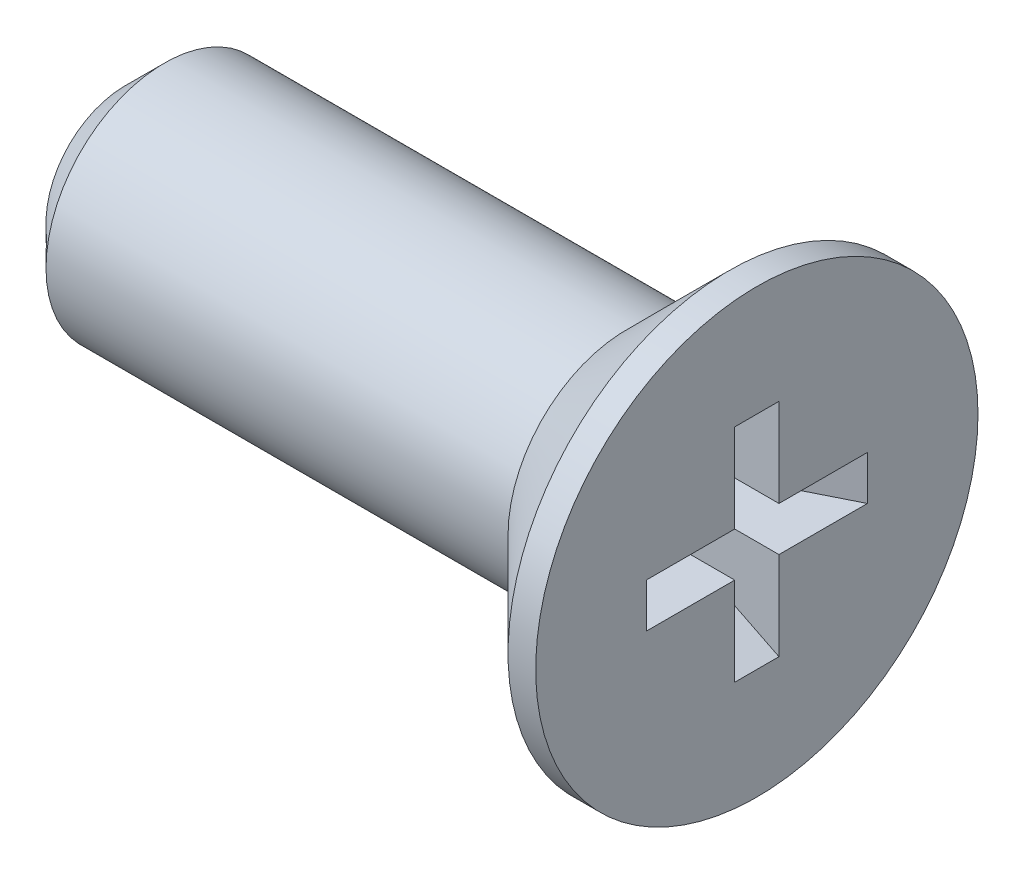
ISO-10303-21;
HEADER;
FILE_DESCRIPTION(('STEP AP214'),'2;1');
FILE_NAME('part.step','',(''),(''),'','','');
FILE_SCHEMA(('AUTOMOTIVE_DESIGN { 1 0 10303 214 1 1 1 1 }'));
ENDSEC;
DATA;
#1=APPLICATION_CONTEXT('core data for automotive mechanical design processes');
#2=APPLICATION_PROTOCOL_DEFINITION('international standard','automotive_design',2000,#1);
#3=PRODUCT_CONTEXT('',#1,'mechanical');
#4=PRODUCT('Part','Part','',(#3));
#5=PRODUCT_RELATED_PRODUCT_CATEGORY('part','',(#4));
#6=PRODUCT_DEFINITION_FORMATION('','',#4);
#7=PRODUCT_DEFINITION_CONTEXT('part definition',#1,'design');
#8=PRODUCT_DEFINITION('design','',#6,#7);
#9=PRODUCT_DEFINITION_SHAPE('','',#8);
#10=(LENGTH_UNIT() NAMED_UNIT(*) SI_UNIT(.MILLI.,.METRE.));
#11=(NAMED_UNIT(*) PLANE_ANGLE_UNIT() SI_UNIT($,.RADIAN.));
#12=(NAMED_UNIT(*) SI_UNIT($,.STERADIAN.) SOLID_ANGLE_UNIT());
#13=UNCERTAINTY_MEASURE_WITH_UNIT(LENGTH_MEASURE(1.E-05),#10,'distance_accuracy_value','');
#14=(GEOMETRIC_REPRESENTATION_CONTEXT(3) GLOBAL_UNCERTAINTY_ASSIGNED_CONTEXT((#13)) GLOBAL_UNIT_ASSIGNED_CONTEXT((#10,
#11,#12)) REPRESENTATION_CONTEXT('',''));
#15=CARTESIAN_POINT('',(0.,0.,0.));
#16=DIRECTION('',(0.,0.,1.));
#17=DIRECTION('',(1.,0.,0.));
#18=AXIS2_PLACEMENT_3D('',#15,#16,#17);
#19=CARTESIAN_POINT('',(0.,0.,-0.28));
#20=DIRECTION('',(0.,0.,-1.));
#21=DIRECTION('',(-1.,0.,0.));
#22=AXIS2_PLACEMENT_3D('',#19,#20,#21);
#23=PLANE('',#22);
#24=DIRECTION('',(1.,0.,0.));
#25=VECTOR('',#24,1.);
#26=CARTESIAN_POINT('',(0.,-0.279999999999999,-0.28));
#27=LINE('',#26,#25);
#28=CARTESIAN_POINT('',(-1.69786374827842,-0.28,-0.28));
#29=VERTEX_POINT('',#28);
#30=CARTESIAN_POINT('',(0.,-0.279999999999999,-0.28));
#31=VERTEX_POINT('',#30);
#32=EDGE_CURVE('E178',#29,#31,#27,.T.);
#33=ORIENTED_EDGE('',*,*,#32,.F.);
#34=DIRECTION('',(0.469471562785891,-0.882947592858927,0.));
#35=VECTOR('',#34,1.);
#36=CARTESIAN_POINT('',(-1.69786374827842,-0.28,-0.28));
#37=LINE('',#36,#35);
#38=CARTESIAN_POINT('',(-1.5,-0.65212758791985,-0.28));
#39=VERTEX_POINT('',#38);
#40=EDGE_CURVE('E185',#29,#39,#37,.T.);
#41=ORIENTED_EDGE('',*,*,#40,.T.);
#42=DIRECTION('',(0.894934361602024,-0.44619781310981,0.));
#43=VECTOR('',#42,1.);
#44=CARTESIAN_POINT('',(-1.5,-0.65212758791985,-0.28));
#45=LINE('',#44,#43);
#46=CARTESIAN_POINT('',(0.,-1.4,-0.28));
#47=VERTEX_POINT('',#46);
#48=EDGE_CURVE('E188',#39,#47,#45,.T.);
#49=ORIENTED_EDGE('',*,*,#48,.T.);
#50=DIRECTION('',(0.,1.,0.));
#51=VECTOR('',#50,1.);
#52=CARTESIAN_POINT('',(0.,1.4,-0.28));
#53=LINE('',#52,#51);
#54=EDGE_CURVE('E193',#47,#31,#53,.T.);
#55=ORIENTED_EDGE('',*,*,#54,.T.);
#56=EDGE_LOOP('',(#33,#41,#49,#55));
#57=FACE_BOUND('',#56,.T.);
#58=ADVANCED_FACE('F39',(#57),#23,.F.);
#59=CARTESIAN_POINT('',(0.,0.,0.28));
#60=DIRECTION('',(0.,0.,-1.));
#61=DIRECTION('',(-1.,0.,0.));
#62=AXIS2_PLACEMENT_3D('',#59,#60,#61);
#63=PLANE('',#62);
#64=DIRECTION('',(0.469471562785891,-0.882947592858927,0.));
#65=VECTOR('',#64,1.);
#66=CARTESIAN_POINT('',(-1.69786374827842,-0.28,0.28));
#67=LINE('',#66,#65);
#68=CARTESIAN_POINT('',(-1.69786374827842,-0.280000000000001,0.279999999999999));
#69=VERTEX_POINT('',#68);
#70=CARTESIAN_POINT('',(-1.5,-0.65212758791985,0.28));
#71=VERTEX_POINT('',#70);
#72=EDGE_CURVE('E184',#69,#71,#67,.T.);
#73=ORIENTED_EDGE('',*,*,#72,.F.);
#74=DIRECTION('',(1.,0.,0.));
#75=VECTOR('',#74,1.);
#76=CARTESIAN_POINT('',(0.,-0.280000000000001,0.28));
#77=LINE('',#76,#75);
#78=CARTESIAN_POINT('',(0.,-0.280000000000001,0.28));
#79=VERTEX_POINT('',#78);
#80=EDGE_CURVE('E47',#69,#79,#77,.T.);
#81=ORIENTED_EDGE('',*,*,#80,.T.);
#82=DIRECTION('',(0.,1.,0.));
#83=VECTOR('',#82,1.);
#84=CARTESIAN_POINT('',(0.,1.4,0.28));
#85=LINE('',#84,#83);
#86=CARTESIAN_POINT('',(0.,-1.4,0.28));
#87=VERTEX_POINT('',#86);
#88=EDGE_CURVE('E210',#87,#79,#85,.T.);
#89=ORIENTED_EDGE('',*,*,#88,.F.);
#90=DIRECTION('',(0.894934361602024,-0.44619781310981,0.));
#91=VECTOR('',#90,1.);
#92=CARTESIAN_POINT('',(-1.5,-0.65212758791985,0.28));
#93=LINE('',#92,#91);
#94=EDGE_CURVE('E207',#71,#87,#93,.T.);
#95=ORIENTED_EDGE('',*,*,#94,.F.);
#96=EDGE_LOOP('',(#73,#81,#89,#95));
#97=FACE_BOUND('',#96,.T.);
#98=ADVANCED_FACE('F257',(#97),#63,.T.);
#99=CARTESIAN_POINT('',(-8.,0.,0.));
#100=DIRECTION('',(1.,0.,0.));
#101=DIRECTION('',(0.,0.,-1.));
#102=AXIS2_PLACEMENT_3D('',#99,#100,#101);
#103=CYLINDRICAL_SURFACE('',#102,1.5);
#104=CARTESIAN_POINT('',(-1.65,0.,0.));
#105=DIRECTION('',(-1.,0.,0.));
#106=DIRECTION('',(0.,0.,1.));
#107=AXIS2_PLACEMENT_3D('',#104,#105,#106);
#108=CIRCLE('',#107,1.5);
#109=CARTESIAN_POINT('',(-1.65,0.,1.5));
#110=VERTEX_POINT('',#109);
#111=EDGE_CURVE('E252',#110,#110,#108,.F.);
#112=ORIENTED_EDGE('',*,*,#111,.F.);
#113=EDGE_LOOP('',(#112));
#114=FACE_BOUND('',#113,.T.);
#115=CARTESIAN_POINT('',(-7.5,0.,0.));
#116=DIRECTION('',(1.,0.,0.));
#117=DIRECTION('',(0.,0.,-1.));
#118=AXIS2_PLACEMENT_3D('',#115,#116,#117);
#119=CIRCLE('',#118,1.5);
#120=CARTESIAN_POINT('',(-7.5,0.,-1.5));
#121=VERTEX_POINT('',#120);
#122=EDGE_CURVE('E244',#121,#121,#119,.T.);
#123=ORIENTED_EDGE('',*,*,#122,.T.);
#124=EDGE_LOOP('',(#123));
#125=FACE_BOUND('',#124,.T.);
#126=ADVANCED_FACE('F308',(#114,#125),#103,.T.);
#127=CARTESIAN_POINT('',(-8.,0.,0.));
#128=DIRECTION('',(1.,0.,0.));
#129=DIRECTION('',(0.,0.,-1.));
#130=AXIS2_PLACEMENT_3D('',#127,#128,#129);
#131=PLANE('',#130);
#132=CARTESIAN_POINT('',(-8.,0.,0.));
#133=DIRECTION('',(1.,0.,0.));
#134=DIRECTION('',(0.,0.,-1.));
#135=AXIS2_PLACEMENT_3D('',#132,#133,#134);
#136=CIRCLE('',#135,0.999999999999998);
#137=CARTESIAN_POINT('',(-8.,0.,-0.999999999999998));
#138=VERTEX_POINT('',#137);
#139=EDGE_CURVE('E248',#138,#138,#136,.F.);
#140=ORIENTED_EDGE('',*,*,#139,.T.);
#141=EDGE_LOOP('',(#140));
#142=FACE_BOUND('',#141,.T.);
#143=ADVANCED_FACE('F330',(#142),#131,.F.);
#144=CARTESIAN_POINT('',(-7.5,0.,0.));
#145=DIRECTION('',(1.,0.,0.));
#146=DIRECTION('',(0.,0.,-1.));
#147=AXIS2_PLACEMENT_3D('',#144,#145,#146);
#148=CONICAL_SURFACE('',#147,1.5,0.78539816339745);
#149=ORIENTED_EDGE('',*,*,#139,.F.);
#150=EDGE_LOOP('',(#149));
#151=FACE_BOUND('',#150,.T.);
#152=ORIENTED_EDGE('',*,*,#122,.F.);
#153=EDGE_LOOP('',(#152));
#154=FACE_BOUND('',#153,.T.);
#155=ADVANCED_FACE('F41',(#151,#154),#148,.T.);
#156=CARTESIAN_POINT('',(0.,0.,0.));
#157=DIRECTION('',(1.,0.,0.));
#158=DIRECTION('',(0.,0.,-1.));
#159=AXIS2_PLACEMENT_3D('',#156,#157,#158);
#160=CYLINDRICAL_SURFACE('',#159,2.8);
#161=CARTESIAN_POINT('',(-0.350000000000004,0.,0.));
#162=DIRECTION('',(1.,0.,0.));
#163=DIRECTION('',(0.,0.,-1.));
#164=AXIS2_PLACEMENT_3D('',#161,#162,#163);
#165=CIRCLE('',#164,2.8);
#166=CARTESIAN_POINT('',(-0.350000000000004,0.,-2.8));
#167=VERTEX_POINT('',#166);
#168=EDGE_CURVE('E224',#167,#167,#165,.T.);
#169=ORIENTED_EDGE('',*,*,#168,.T.);
#170=EDGE_LOOP('',(#169));
#171=FACE_BOUND('',#170,.T.);
#172=CARTESIAN_POINT('',(0.,0.,0.));
#173=DIRECTION('',(1.,0.,0.));
#174=DIRECTION('',(0.,0.,-1.));
#175=AXIS2_PLACEMENT_3D('',#172,#173,#174);
#176=CIRCLE('',#175,2.8);
#177=CARTESIAN_POINT('',(0.,0.,-2.8));
#178=VERTEX_POINT('',#177);
#179=EDGE_CURVE('E240',#178,#178,#176,.T.);
#180=ORIENTED_EDGE('',*,*,#179,.F.);
#181=EDGE_LOOP('',(#180));
#182=FACE_BOUND('',#181,.T.);
#183=ADVANCED_FACE('F325',(#171,#182),#160,.T.);
#184=CARTESIAN_POINT('',(-0.350000000000004,0.,0.));
#185=DIRECTION('',(1.,0.,0.));
#186=DIRECTION('',(0.,0.,-1.));
#187=AXIS2_PLACEMENT_3D('',#184,#185,#186);
#188=CONICAL_SURFACE('',#187,2.8,0.78539816339745);
#189=ORIENTED_EDGE('',*,*,#111,.T.);
#190=EDGE_LOOP('',(#189));
#191=FACE_BOUND('',#190,.T.);
#192=ORIENTED_EDGE('',*,*,#168,.F.);
#193=EDGE_LOOP('',(#192));
#194=FACE_BOUND('',#193,.T.);
#195=ADVANCED_FACE('F322',(#191,#194),#188,.T.);
#196=CARTESIAN_POINT('',(0.,0.,0.));
#197=DIRECTION('',(1.,0.,0.));
#198=DIRECTION('',(0.,0.,-1.));
#199=AXIS2_PLACEMENT_3D('',#196,#197,#198);
#200=PLANE('',#199);
#201=DIRECTION('',(0.,0.,1.));
#202=VECTOR('',#201,1.);
#203=CARTESIAN_POINT('',(0.,0.279999999999995,1.4));
#204=LINE('',#203,#202);
#205=CARTESIAN_POINT('',(0.,0.280000000000005,-1.4));
#206=VERTEX_POINT('',#205);
#207=CARTESIAN_POINT('',(0.,0.280000000000001,-0.28));
#208=VERTEX_POINT('',#207);
#209=EDGE_CURVE('E161',#206,#208,#204,.T.);
#210=ORIENTED_EDGE('',*,*,#209,.F.);
#211=DIRECTION('',(0.,-1.,0.));
#212=VECTOR('',#211,1.);
#213=CARTESIAN_POINT('',(0.,0.280000000000005,-1.4));
#214=LINE('',#213,#212);
#215=CARTESIAN_POINT('',(0.,-0.279999999999995,-1.4));
#216=VERTEX_POINT('',#215);
#217=EDGE_CURVE('E141',#206,#216,#214,.T.);
#218=ORIENTED_EDGE('',*,*,#217,.T.);
#219=DIRECTION('',(0.,0.,1.));
#220=VECTOR('',#219,1.);
#221=CARTESIAN_POINT('',(0.,-0.280000000000005,1.4));
#222=LINE('',#221,#220);
#223=EDGE_CURVE('E171',#216,#31,#222,.T.);
#224=ORIENTED_EDGE('',*,*,#223,.T.);
#225=ORIENTED_EDGE('',*,*,#54,.F.);
#226=DIRECTION('',(0.,0.,1.));
#227=VECTOR('',#226,1.);
#228=CARTESIAN_POINT('',(0.,-1.4,-0.28));
#229=LINE('',#228,#227);
#230=EDGE_CURVE('E233',#47,#87,#229,.T.);
#231=ORIENTED_EDGE('',*,*,#230,.T.);
#232=ORIENTED_EDGE('',*,*,#88,.T.);
#233=CARTESIAN_POINT('',(0.,-0.280000000000005,1.4));
#234=VERTEX_POINT('',#233);
#235=EDGE_CURVE('E54',#79,#234,#222,.T.);
#236=ORIENTED_EDGE('',*,*,#235,.T.);
#237=DIRECTION('',(0.,-1.,0.));
#238=VECTOR('',#237,1.);
#239=CARTESIAN_POINT('',(0.,0.279999999999995,1.4));
#240=LINE('',#239,#238);
#241=CARTESIAN_POINT('',(0.,0.279999999999995,1.4));
#242=VERTEX_POINT('',#241);
#243=EDGE_CURVE('E179',#242,#234,#240,.T.);
#244=ORIENTED_EDGE('',*,*,#243,.F.);
#245=CARTESIAN_POINT('',(0.,0.279999999999999,0.28));
#246=VERTEX_POINT('',#245);
#247=EDGE_CURVE('E150',#246,#242,#204,.T.);
#248=ORIENTED_EDGE('',*,*,#247,.F.);
#249=CARTESIAN_POINT('',(0.,1.4,0.28));
#250=VERTEX_POINT('',#249);
#251=EDGE_CURVE('E62',#246,#250,#85,.T.);
#252=ORIENTED_EDGE('',*,*,#251,.T.);
#253=DIRECTION('',(0.,0.,1.));
#254=VECTOR('',#253,1.);
#255=CARTESIAN_POINT('',(0.,1.4,-0.28));
#256=LINE('',#255,#254);
#257=CARTESIAN_POINT('',(0.,1.4,-0.28));
#258=VERTEX_POINT('',#257);
#259=EDGE_CURVE('E230',#258,#250,#256,.T.);
#260=ORIENTED_EDGE('',*,*,#259,.F.);
#261=EDGE_CURVE('E192',#208,#258,#53,.T.);
#262=ORIENTED_EDGE('',*,*,#261,.F.);
#263=EDGE_LOOP('',(#210,#218,#224,#225,#231,#232,#236,#244,#248,#252,#260,#262));
#264=FACE_BOUND('',#263,.T.);
#265=ORIENTED_EDGE('',*,*,#179,.T.);
#266=EDGE_LOOP('',(#265));
#267=FACE_BOUND('',#266,.T.);
#268=ADVANCED_FACE('F260',(#264,#267),#200,.T.);
#269=CARTESIAN_POINT('',(-1.69786374827842,-0.28,-0.28));
#270=DIRECTION('',(-0.882947592858927,-0.469471562785891,0.));
#271=DIRECTION('',(0.469471562785891,-0.882947592858927,0.));
#272=AXIS2_PLACEMENT_3D('',#269,#270,#271);
#273=PLANE('',#272);
#274=ORIENTED_EDGE('',*,*,#72,.T.);
#275=DIRECTION('',(0.,0.,1.));
#276=VECTOR('',#275,1.);
#277=CARTESIAN_POINT('',(-1.5,-0.65212758791985,-0.28));
#278=LINE('',#277,#276);
#279=EDGE_CURVE('E204',#39,#71,#278,.T.);
#280=ORIENTED_EDGE('',*,*,#279,.F.);
#281=ORIENTED_EDGE('',*,*,#40,.F.);
#282=DIRECTION('',(0.,0.,1.));
#283=VECTOR('',#282,1.);
#284=CARTESIAN_POINT('',(-1.69786374827842,-0.28,-0.28));
#285=LINE('',#284,#283);
#286=EDGE_CURVE('E221',#29,#69,#285,.T.);
#287=ORIENTED_EDGE('',*,*,#286,.T.);
#288=EDGE_LOOP('',(#274,#280,#281,#287));
#289=FACE_BOUND('',#288,.T.);
#290=ADVANCED_FACE('F272',(#289),#273,.F.);
#291=CARTESIAN_POINT('',(-1.69786374827842,-0.28,-0.28));
#292=DIRECTION('',(-1.,0.,0.));
#293=DIRECTION('',(0.,0.,1.));
#294=AXIS2_PLACEMENT_3D('',#291,#292,#293);
#295=PLANE('',#294);
#296=DIRECTION('',(0.,-1.,0.));
#297=VECTOR('',#296,1.);
#298=CARTESIAN_POINT('',(-1.69786374827842,-0.28,0.28));
#299=LINE('',#298,#297);
#300=CARTESIAN_POINT('',(-1.69786374827842,0.279999999999999,0.280000000000001));
#301=VERTEX_POINT('',#300);
#302=EDGE_CURVE('E189',#301,#69,#299,.T.);
#303=ORIENTED_EDGE('',*,*,#302,.T.);
#304=ORIENTED_EDGE('',*,*,#286,.F.);
#305=DIRECTION('',(0.,-1.,0.));
#306=VECTOR('',#305,1.);
#307=CARTESIAN_POINT('',(-1.69786374827842,-0.28,-0.28));
#308=LINE('',#307,#306);
#309=CARTESIAN_POINT('',(-1.69786374827842,0.280000000000001,-0.279999999999999));
#310=VERTEX_POINT('',#309);
#311=EDGE_CURVE('E202',#310,#29,#308,.T.);
#312=ORIENTED_EDGE('',*,*,#311,.F.);
#313=DIRECTION('',(0.,0.,1.));
#314=VECTOR('',#313,1.);
#315=CARTESIAN_POINT('',(-1.69786374827842,0.28,-0.28));
#316=LINE('',#315,#314);
#317=EDGE_CURVE('E225',#310,#301,#316,.T.);
#318=ORIENTED_EDGE('',*,*,#317,.T.);
#319=EDGE_LOOP('',(#303,#304,#312,#318));
#320=FACE_BOUND('',#319,.T.);
#321=ADVANCED_FACE('F275',(#320),#295,.F.);
#322=CARTESIAN_POINT('',(-1.5,0.652127587919849,-0.28));
#323=DIRECTION('',(-0.882947592858927,0.469471562785891,0.));
#324=DIRECTION('',(-0.469471562785891,-0.882947592858927,0.));
#325=AXIS2_PLACEMENT_3D('',#322,#323,#324);
#326=PLANE('',#325);
#327=DIRECTION('',(-0.469471562785891,-0.882947592858927,0.));
#328=VECTOR('',#327,1.);
#329=CARTESIAN_POINT('',(-1.5,0.652127587919849,0.28));
#330=LINE('',#329,#328);
#331=CARTESIAN_POINT('',(-1.5,0.652127587919849,0.28));
#332=VERTEX_POINT('',#331);
#333=EDGE_CURVE('E216',#332,#301,#330,.T.);
#334=ORIENTED_EDGE('',*,*,#333,.T.);
#335=ORIENTED_EDGE('',*,*,#317,.F.);
#336=DIRECTION('',(-0.469471562785891,-0.882947592858927,0.));
#337=VECTOR('',#336,1.);
#338=CARTESIAN_POINT('',(-1.5,0.652127587919849,-0.28));
#339=LINE('',#338,#337);
#340=CARTESIAN_POINT('',(-1.5,0.652127587919849,-0.28));
#341=VERTEX_POINT('',#340);
#342=EDGE_CURVE('E199',#341,#310,#339,.T.);
#343=ORIENTED_EDGE('',*,*,#342,.F.);
#344=DIRECTION('',(0.,0.,1.));
#345=VECTOR('',#344,1.);
#346=CARTESIAN_POINT('',(-1.5,0.652127587919849,-0.28));
#347=LINE('',#346,#345);
#348=EDGE_CURVE('E228',#341,#332,#347,.T.);
#349=ORIENTED_EDGE('',*,*,#348,.T.);
#350=EDGE_LOOP('',(#334,#335,#343,#349));
#351=FACE_BOUND('',#350,.T.);
#352=ADVANCED_FACE('F294',(#351),#326,.F.);
#353=CARTESIAN_POINT('',(0.,1.4,-0.28));
#354=DIRECTION('',(-0.44619781310981,0.894934361602024,0.));
#355=DIRECTION('',(-0.894934361602024,-0.44619781310981,0.));
#356=AXIS2_PLACEMENT_3D('',#353,#354,#355);
#357=PLANE('',#356);
#358=DIRECTION('',(-0.894934361602024,-0.44619781310981,0.));
#359=VECTOR('',#358,1.);
#360=CARTESIAN_POINT('',(0.,1.4,0.28));
#361=LINE('',#360,#359);
#362=EDGE_CURVE('E213',#250,#332,#361,.T.);
#363=ORIENTED_EDGE('',*,*,#362,.T.);
#364=ORIENTED_EDGE('',*,*,#348,.F.);
#365=DIRECTION('',(-0.894934361602024,-0.44619781310981,0.));
#366=VECTOR('',#365,1.);
#367=CARTESIAN_POINT('',(0.,1.4,-0.28));
#368=LINE('',#367,#366);
#369=EDGE_CURVE('E196',#258,#341,#368,.T.);
#370=ORIENTED_EDGE('',*,*,#369,.F.);
#371=ORIENTED_EDGE('',*,*,#259,.T.);
#372=EDGE_LOOP('',(#363,#364,#370,#371));
#373=FACE_BOUND('',#372,.T.);
#374=ADVANCED_FACE('F288',(#373),#357,.F.);
#375=CARTESIAN_POINT('',(-1.5,-0.65212758791985,-0.28));
#376=DIRECTION('',(-0.44619781310981,-0.894934361602024,0.));
#377=DIRECTION('',(0.894934361602024,-0.44619781310981,0.));
#378=AXIS2_PLACEMENT_3D('',#375,#376,#377);
#379=PLANE('',#378);
#380=ORIENTED_EDGE('',*,*,#94,.T.);
#381=ORIENTED_EDGE('',*,*,#230,.F.);
#382=ORIENTED_EDGE('',*,*,#48,.F.);
#383=ORIENTED_EDGE('',*,*,#279,.T.);
#384=EDGE_LOOP('',(#380,#381,#382,#383));
#385=FACE_BOUND('',#384,.T.);
#386=ADVANCED_FACE('F266',(#385),#379,.F.);
#387=ORIENTED_EDGE('',*,*,#342,.T.);
#388=DIRECTION('',(1.,0.,0.));
#389=VECTOR('',#388,1.);
#390=CARTESIAN_POINT('',(0.,0.280000000000001,-0.28));
#391=LINE('',#390,#389);
#392=EDGE_CURVE('E154',#310,#208,#391,.T.);
#393=ORIENTED_EDGE('',*,*,#392,.T.);
#394=ORIENTED_EDGE('',*,*,#261,.T.);
#395=ORIENTED_EDGE('',*,*,#369,.T.);
#396=EDGE_LOOP('',(#387,#393,#394,#395));
#397=FACE_BOUND('',#396,.T.);
#398=ADVANCED_FACE('F291',(#397),#23,.F.);
#399=DIRECTION('',(1.,0.,0.));
#400=VECTOR('',#399,1.);
#401=CARTESIAN_POINT('',(0.,0.279999999999999,0.28));
#402=LINE('',#401,#400);
#403=EDGE_CURVE('E12',#301,#246,#402,.T.);
#404=ORIENTED_EDGE('',*,*,#403,.F.);
#405=ORIENTED_EDGE('',*,*,#333,.F.);
#406=ORIENTED_EDGE('',*,*,#362,.F.);
#407=ORIENTED_EDGE('',*,*,#251,.F.);
#408=EDGE_LOOP('',(#404,#405,#406,#407));
#409=FACE_BOUND('',#408,.T.);
#410=ADVANCED_FACE('F285',(#409),#63,.T.);
#411=CARTESIAN_POINT('',(0.,0.28,0.));
#412=DIRECTION('',(0.,1.,0.));
#413=DIRECTION('',(-1.,0.,0.));
#414=AXIS2_PLACEMENT_3D('',#411,#412,#413);
#415=PLANE('',#414);
#416=ORIENTED_EDGE('',*,*,#403,.T.);
#417=ORIENTED_EDGE('',*,*,#247,.T.);
#418=DIRECTION('',(-0.894934361602024,0.,-0.44619781310981));
#419=VECTOR('',#418,1.);
#420=CARTESIAN_POINT('',(0.,0.279999999999995,1.4));
#421=LINE('',#420,#419);
#422=CARTESIAN_POINT('',(-1.5,0.279999999999998,0.65212758791985));
#423=VERTEX_POINT('',#422);
#424=EDGE_CURVE('E163',#242,#423,#421,.T.);
#425=ORIENTED_EDGE('',*,*,#424,.T.);
#426=DIRECTION('',(-0.469471562785891,0.,-0.882947592858927));
#427=VECTOR('',#426,1.);
#428=CARTESIAN_POINT('',(-1.5,0.279999999999998,0.65212758791985));
#429=LINE('',#428,#427);
#430=EDGE_CURVE('E142',#423,#301,#429,.T.);
#431=ORIENTED_EDGE('',*,*,#430,.T.);
#432=EDGE_LOOP('',(#416,#417,#425,#431));
#433=FACE_BOUND('',#432,.T.);
#434=ADVANCED_FACE('F281',(#433),#415,.F.);
#435=CARTESIAN_POINT('',(0.,-0.28,0.));
#436=DIRECTION('',(0.,1.,0.));
#437=DIRECTION('',(-1.,0.,0.));
#438=AXIS2_PLACEMENT_3D('',#435,#436,#437);
#439=PLANE('',#438);
#440=DIRECTION('',(-0.469471562785891,0.,-0.882947592858927));
#441=VECTOR('',#440,1.);
#442=CARTESIAN_POINT('',(-1.5,-0.280000000000002,0.652127587919848));
#443=LINE('',#442,#441);
#444=CARTESIAN_POINT('',(-1.5,-0.280000000000002,0.652127587919848));
#445=VERTEX_POINT('',#444);
#446=EDGE_CURVE('E155',#445,#69,#443,.T.);
#447=ORIENTED_EDGE('',*,*,#446,.F.);
#448=DIRECTION('',(-0.894934361602024,0.,-0.44619781310981));
#449=VECTOR('',#448,1.);
#450=CARTESIAN_POINT('',(0.,-0.280000000000005,1.4));
#451=LINE('',#450,#449);
#452=EDGE_CURVE('E158',#234,#445,#451,.T.);
#453=ORIENTED_EDGE('',*,*,#452,.F.);
#454=ORIENTED_EDGE('',*,*,#235,.F.);
#455=ORIENTED_EDGE('',*,*,#80,.F.);
#456=EDGE_LOOP('',(#447,#453,#454,#455));
#457=FACE_BOUND('',#456,.T.);
#458=ADVANCED_FACE('F399',(#457),#439,.T.);
#459=CARTESIAN_POINT('',(-1.5,0.279999999999998,0.65212758791985));
#460=DIRECTION('',(-0.882947592858927,0.,0.469471562785891));
#461=DIRECTION('',(0.469471562785891,0.,0.882947592858927));
#462=AXIS2_PLACEMENT_3D('',#459,#460,#461);
#463=PLANE('',#462);
#464=ORIENTED_EDGE('',*,*,#446,.T.);
#465=ORIENTED_EDGE('',*,*,#302,.F.);
#466=ORIENTED_EDGE('',*,*,#430,.F.);
#467=DIRECTION('',(0.,-1.,0.));
#468=VECTOR('',#467,1.);
#469=CARTESIAN_POINT('',(-1.5,0.279999999999998,0.65212758791985));
#470=LINE('',#469,#468);
#471=EDGE_CURVE('E176',#423,#445,#470,.T.);
#472=ORIENTED_EDGE('',*,*,#471,.T.);
#473=EDGE_LOOP('',(#464,#465,#466,#472));
#474=FACE_BOUND('',#473,.T.);
#475=ADVANCED_FACE('F278',(#474),#463,.F.);
#476=CARTESIAN_POINT('',(0.,0.279999999999995,1.4));
#477=DIRECTION('',(-0.44619781310981,0.,0.894934361602024));
#478=DIRECTION('',(0.894934361602024,0.,0.44619781310981));
#479=AXIS2_PLACEMENT_3D('',#476,#477,#478);
#480=PLANE('',#479);
#481=ORIENTED_EDGE('',*,*,#452,.T.);
#482=ORIENTED_EDGE('',*,*,#471,.F.);
#483=ORIENTED_EDGE('',*,*,#424,.F.);
#484=ORIENTED_EDGE('',*,*,#243,.T.);
#485=EDGE_LOOP('',(#481,#482,#483,#484));
#486=FACE_BOUND('',#485,.T.);
#487=ADVANCED_FACE('F418',(#486),#480,.F.);
#488=DIRECTION('',(0.469471562785891,0.,-0.882947592858927));
#489=VECTOR('',#488,1.);
#490=CARTESIAN_POINT('',(-1.69786374827842,0.280000000000001,-0.279999999999999));
#491=LINE('',#490,#489);
#492=CARTESIAN_POINT('',(-1.5,0.280000000000002,-0.652127587919849));
#493=VERTEX_POINT('',#492);
#494=EDGE_CURVE('E135',#310,#493,#491,.T.);
#495=ORIENTED_EDGE('',*,*,#494,.T.);
#496=DIRECTION('',(0.894934361602024,0.,-0.44619781310981));
#497=VECTOR('',#496,1.);
#498=CARTESIAN_POINT('',(-1.5,0.280000000000002,-0.652127587919849));
#499=LINE('',#498,#497);
#500=EDGE_CURVE('E145',#493,#206,#499,.T.);
#501=ORIENTED_EDGE('',*,*,#500,.T.);
#502=ORIENTED_EDGE('',*,*,#209,.T.);
#503=ORIENTED_EDGE('',*,*,#392,.F.);
#504=EDGE_LOOP('',(#495,#501,#502,#503));
#505=FACE_BOUND('',#504,.T.);
#506=ADVANCED_FACE('F152',(#505),#415,.F.);
#507=ORIENTED_EDGE('',*,*,#32,.T.);
#508=ORIENTED_EDGE('',*,*,#223,.F.);
#509=DIRECTION('',(0.894934361602024,0.,-0.44619781310981));
#510=VECTOR('',#509,1.);
#511=CARTESIAN_POINT('',(-1.5,-0.279999999999998,-0.652127587919851));
#512=LINE('',#511,#510);
#513=CARTESIAN_POINT('',(-1.5,-0.279999999999998,-0.652127587919851));
#514=VERTEX_POINT('',#513);
#515=EDGE_CURVE('E169',#514,#216,#512,.T.);
#516=ORIENTED_EDGE('',*,*,#515,.F.);
#517=DIRECTION('',(0.469471562785891,0.,-0.882947592858927));
#518=VECTOR('',#517,1.);
#519=CARTESIAN_POINT('',(-1.69786374827842,-0.279999999999999,-0.280000000000001));
#520=LINE('',#519,#518);
#521=EDGE_CURVE('E137',#29,#514,#520,.T.);
#522=ORIENTED_EDGE('',*,*,#521,.F.);
#523=EDGE_LOOP('',(#507,#508,#516,#522));
#524=FACE_BOUND('',#523,.T.);
#525=ADVANCED_FACE('F410',(#524),#439,.T.);
#526=CARTESIAN_POINT('',(-1.69786374827842,0.280000000000001,-0.279999999999999));
#527=DIRECTION('',(-0.882947592858927,0.,-0.469471562785891));
#528=DIRECTION('',(-0.469471562785891,0.,0.882947592858927));
#529=AXIS2_PLACEMENT_3D('',#526,#527,#528);
#530=PLANE('',#529);
#531=ORIENTED_EDGE('',*,*,#521,.T.);
#532=DIRECTION('',(0.,-1.,0.));
#533=VECTOR('',#532,1.);
#534=CARTESIAN_POINT('',(-1.5,0.280000000000002,-0.652127587919849));
#535=LINE('',#534,#533);
#536=EDGE_CURVE('E130',#493,#514,#535,.T.);
#537=ORIENTED_EDGE('',*,*,#536,.F.);
#538=ORIENTED_EDGE('',*,*,#494,.F.);
#539=ORIENTED_EDGE('',*,*,#311,.T.);
#540=EDGE_LOOP('',(#531,#537,#538,#539));
#541=FACE_BOUND('',#540,.T.);
#542=ADVANCED_FACE('F132',(#541),#530,.F.);
#543=CARTESIAN_POINT('',(-1.5,0.280000000000002,-0.652127587919849));
#544=DIRECTION('',(-0.44619781310981,0.,-0.894934361602024));
#545=DIRECTION('',(-0.894934361602024,0.,0.44619781310981));
#546=AXIS2_PLACEMENT_3D('',#543,#544,#545);
#547=PLANE('',#546);
#548=ORIENTED_EDGE('',*,*,#515,.T.);
#549=ORIENTED_EDGE('',*,*,#217,.F.);
#550=ORIENTED_EDGE('',*,*,#500,.F.);
#551=ORIENTED_EDGE('',*,*,#536,.T.);
#552=EDGE_LOOP('',(#548,#549,#550,#551));
#553=FACE_BOUND('',#552,.T.);
#554=ADVANCED_FACE('F146',(#553),#547,.F.);
#555=CLOSED_SHELL('',(#58,#98,#126,#143,#155,#183,#195,#268,#290,#321,#352,#374,#386,#398,#410,
#434,#458,#475,#487,#506,#525,#542,#554));
#556=MANIFOLD_SOLID_BREP('B2',#555);
#557=ADVANCED_BREP_SHAPE_REPRESENTATION('',(#18,#556),#14);
#558=SHAPE_DEFINITION_REPRESENTATION(#9,#557);
ENDSEC;
END-ISO-10303-21;
